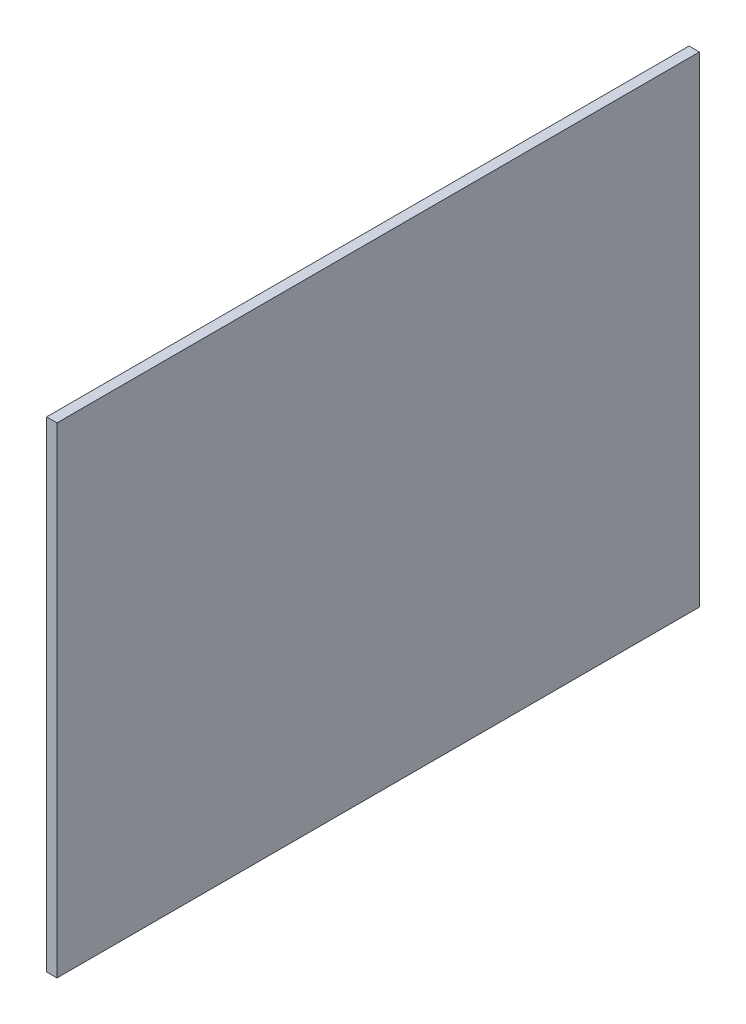
ISO-10303-21;
HEADER;
FILE_DESCRIPTION(('STEP AP214'),'2;1');
FILE_NAME('part.step','',(''),(''),'','','');
FILE_SCHEMA(('AUTOMOTIVE_DESIGN { 1 0 10303 214 1 1 1 1 }'));
ENDSEC;
DATA;
#1=APPLICATION_CONTEXT('core data for automotive mechanical design processes');
#2=APPLICATION_PROTOCOL_DEFINITION('international standard','automotive_design',2000,#1);
#3=PRODUCT_CONTEXT('',#1,'mechanical');
#4=PRODUCT('Part','Part','',(#3));
#5=PRODUCT_RELATED_PRODUCT_CATEGORY('part','',(#4));
#6=PRODUCT_DEFINITION_FORMATION('','',#4);
#7=PRODUCT_DEFINITION_CONTEXT('part definition',#1,'design');
#8=PRODUCT_DEFINITION('design','',#6,#7);
#9=PRODUCT_DEFINITION_SHAPE('','',#8);
#10=(LENGTH_UNIT() NAMED_UNIT(*) SI_UNIT(.MILLI.,.METRE.));
#11=(NAMED_UNIT(*) PLANE_ANGLE_UNIT() SI_UNIT($,.RADIAN.));
#12=(NAMED_UNIT(*) SI_UNIT($,.STERADIAN.) SOLID_ANGLE_UNIT());
#13=UNCERTAINTY_MEASURE_WITH_UNIT(LENGTH_MEASURE(1.E-05),#10,'distance_accuracy_value','');
#14=(GEOMETRIC_REPRESENTATION_CONTEXT(3) GLOBAL_UNCERTAINTY_ASSIGNED_CONTEXT((#13)) GLOBAL_UNIT_ASSIGNED_CONTEXT((#10,
#11,#12)) REPRESENTATION_CONTEXT('',''));
#15=CARTESIAN_POINT('',(0.,0.,0.));
#16=DIRECTION('',(0.,0.,1.));
#17=DIRECTION('',(1.,0.,0.));
#18=AXIS2_PLACEMENT_3D('',#15,#16,#17);
#19=CARTESIAN_POINT('',(1.5875,0.,98.425));
#20=DIRECTION('',(0.,1.,0.));
#21=DIRECTION('',(0.,0.,1.));
#22=AXIS2_PLACEMENT_3D('',#19,#20,#21);
#23=PLANE('',#22);
#24=DIRECTION('',(1.,0.,0.));
#25=VECTOR('',#24,1.);
#26=CARTESIAN_POINT('',(1.5875,0.,0.));
#27=LINE('',#26,#25);
#28=CARTESIAN_POINT('',(0.,0.,0.));
#29=VERTEX_POINT('',#28);
#30=CARTESIAN_POINT('',(1.5875,0.,0.));
#31=VERTEX_POINT('',#30);
#32=EDGE_CURVE('E112',#29,#31,#27,.T.);
#33=ORIENTED_EDGE('',*,*,#32,.T.);
#34=DIRECTION('',(0.,0.,-1.));
#35=VECTOR('',#34,1.);
#36=CARTESIAN_POINT('',(1.5875,0.,98.425));
#37=LINE('',#36,#35);
#38=CARTESIAN_POINT('',(1.5875,0.,98.425));
#39=VERTEX_POINT('',#38);
#40=EDGE_CURVE('E11',#39,#31,#37,.T.);
#41=ORIENTED_EDGE('',*,*,#40,.F.);
#42=DIRECTION('',(1.,0.,0.));
#43=VECTOR('',#42,1.);
#44=CARTESIAN_POINT('',(1.5875,0.,98.425));
#45=LINE('',#44,#43);
#46=CARTESIAN_POINT('',(0.,0.,98.425));
#47=VERTEX_POINT('',#46);
#48=EDGE_CURVE('E96',#47,#39,#45,.T.);
#49=ORIENTED_EDGE('',*,*,#48,.F.);
#50=DIRECTION('',(0.,0.,-1.));
#51=VECTOR('',#50,1.);
#52=CARTESIAN_POINT('',(0.,0.,98.425));
#53=LINE('',#52,#51);
#54=EDGE_CURVE('E108',#47,#29,#53,.T.);
#55=ORIENTED_EDGE('',*,*,#54,.T.);
#56=EDGE_LOOP('',(#33,#41,#49,#55));
#57=FACE_BOUND('',#56,.T.);
#58=ADVANCED_FACE('F41',(#57),#23,.F.);
#59=CARTESIAN_POINT('',(1.5875,73.66,98.425));
#60=DIRECTION('',(-1.,0.,0.));
#61=DIRECTION('',(0.,0.,1.));
#62=AXIS2_PLACEMENT_3D('',#59,#60,#61);
#63=PLANE('',#62);
#64=DIRECTION('',(0.,1.,0.));
#65=VECTOR('',#64,1.);
#66=CARTESIAN_POINT('',(1.5875,73.66,0.));
#67=LINE('',#66,#65);
#68=CARTESIAN_POINT('',(1.5875,73.66,0.));
#69=VERTEX_POINT('',#68);
#70=EDGE_CURVE('E101',#31,#69,#67,.T.);
#71=ORIENTED_EDGE('',*,*,#70,.T.);
#72=DIRECTION('',(0.,0.,-1.));
#73=VECTOR('',#72,1.);
#74=CARTESIAN_POINT('',(1.5875,73.66,98.425));
#75=LINE('',#74,#73);
#76=CARTESIAN_POINT('',(1.5875,73.66,98.425));
#77=VERTEX_POINT('',#76);
#78=EDGE_CURVE('E50',#77,#69,#75,.T.);
#79=ORIENTED_EDGE('',*,*,#78,.F.);
#80=DIRECTION('',(0.,1.,0.));
#81=VECTOR('',#80,1.);
#82=CARTESIAN_POINT('',(1.5875,73.66,98.425));
#83=LINE('',#82,#81);
#84=EDGE_CURVE('E90',#39,#77,#83,.T.);
#85=ORIENTED_EDGE('',*,*,#84,.F.);
#86=ORIENTED_EDGE('',*,*,#40,.T.);
#87=EDGE_LOOP('',(#71,#79,#85,#86));
#88=FACE_BOUND('',#87,.T.);
#89=ADVANCED_FACE('F100',(#88),#63,.F.);
#90=CARTESIAN_POINT('',(0.,73.66,98.425));
#91=DIRECTION('',(0.,-1.,0.));
#92=DIRECTION('',(0.,0.,-1.));
#93=AXIS2_PLACEMENT_3D('',#90,#91,#92);
#94=PLANE('',#93);
#95=DIRECTION('',(-1.,0.,0.));
#96=VECTOR('',#95,1.);
#97=CARTESIAN_POINT('',(0.,73.66,0.));
#98=LINE('',#97,#96);
#99=CARTESIAN_POINT('',(0.,73.66,0.));
#100=VERTEX_POINT('',#99);
#101=EDGE_CURVE('E77',#69,#100,#98,.T.);
#102=ORIENTED_EDGE('',*,*,#101,.T.);
#103=DIRECTION('',(0.,0.,-1.));
#104=VECTOR('',#103,1.);
#105=CARTESIAN_POINT('',(0.,73.66,98.425));
#106=LINE('',#105,#104);
#107=CARTESIAN_POINT('',(0.,73.66,98.425));
#108=VERTEX_POINT('',#107);
#109=EDGE_CURVE('E103',#108,#100,#106,.T.);
#110=ORIENTED_EDGE('',*,*,#109,.F.);
#111=DIRECTION('',(-1.,0.,0.));
#112=VECTOR('',#111,1.);
#113=CARTESIAN_POINT('',(0.,73.66,98.425));
#114=LINE('',#113,#112);
#115=EDGE_CURVE('E94',#77,#108,#114,.T.);
#116=ORIENTED_EDGE('',*,*,#115,.F.);
#117=ORIENTED_EDGE('',*,*,#78,.T.);
#118=EDGE_LOOP('',(#102,#110,#116,#117));
#119=FACE_BOUND('',#118,.T.);
#120=ADVANCED_FACE('F104',(#119),#94,.F.);
#121=CARTESIAN_POINT('',(0.,0.,98.425));
#122=DIRECTION('',(1.,0.,0.));
#123=DIRECTION('',(0.,0.,-1.));
#124=AXIS2_PLACEMENT_3D('',#121,#122,#123);
#125=PLANE('',#124);
#126=DIRECTION('',(0.,-1.,0.));
#127=VECTOR('',#126,1.);
#128=CARTESIAN_POINT('',(0.,0.,0.));
#129=LINE('',#128,#127);
#130=EDGE_CURVE('E83',#100,#29,#129,.T.);
#131=ORIENTED_EDGE('',*,*,#130,.T.);
#132=ORIENTED_EDGE('',*,*,#54,.F.);
#133=DIRECTION('',(0.,-1.,0.));
#134=VECTOR('',#133,1.);
#135=CARTESIAN_POINT('',(0.,0.,98.425));
#136=LINE('',#135,#134);
#137=EDGE_CURVE('E58',#108,#47,#136,.T.);
#138=ORIENTED_EDGE('',*,*,#137,.F.);
#139=ORIENTED_EDGE('',*,*,#109,.T.);
#140=EDGE_LOOP('',(#131,#132,#138,#139));
#141=FACE_BOUND('',#140,.T.);
#142=ADVANCED_FACE('F124',(#141),#125,.F.);
#143=CARTESIAN_POINT('',(0.,0.,98.425));
#144=DIRECTION('',(0.,0.,-1.));
#145=DIRECTION('',(-1.,0.,0.));
#146=AXIS2_PLACEMENT_3D('',#143,#144,#145);
#147=PLANE('',#146);
#148=ORIENTED_EDGE('',*,*,#48,.T.);
#149=ORIENTED_EDGE('',*,*,#84,.T.);
#150=ORIENTED_EDGE('',*,*,#115,.T.);
#151=ORIENTED_EDGE('',*,*,#137,.T.);
#152=EDGE_LOOP('',(#148,#149,#150,#151));
#153=FACE_BOUND('',#152,.T.);
#154=ADVANCED_FACE('F92',(#153),#147,.F.);
#155=CARTESIAN_POINT('',(0.,0.,0.));
#156=DIRECTION('',(0.,0.,-1.));
#157=DIRECTION('',(-1.,0.,0.));
#158=AXIS2_PLACEMENT_3D('',#155,#156,#157);
#159=PLANE('',#158);
#160=ORIENTED_EDGE('',*,*,#32,.F.);
#161=ORIENTED_EDGE('',*,*,#130,.F.);
#162=ORIENTED_EDGE('',*,*,#101,.F.);
#163=ORIENTED_EDGE('',*,*,#70,.F.);
#164=EDGE_LOOP('',(#160,#161,#162,#163));
#165=FACE_BOUND('',#164,.T.);
#166=ADVANCED_FACE('F127',(#165),#159,.T.);
#167=CLOSED_SHELL('',(#58,#89,#120,#142,#154,#166));
#168=MANIFOLD_SOLID_BREP('B2',#167);
#169=ADVANCED_BREP_SHAPE_REPRESENTATION('',(#18,#168),#14);
#170=SHAPE_DEFINITION_REPRESENTATION(#9,#169);
ENDSEC;
END-ISO-10303-21;
